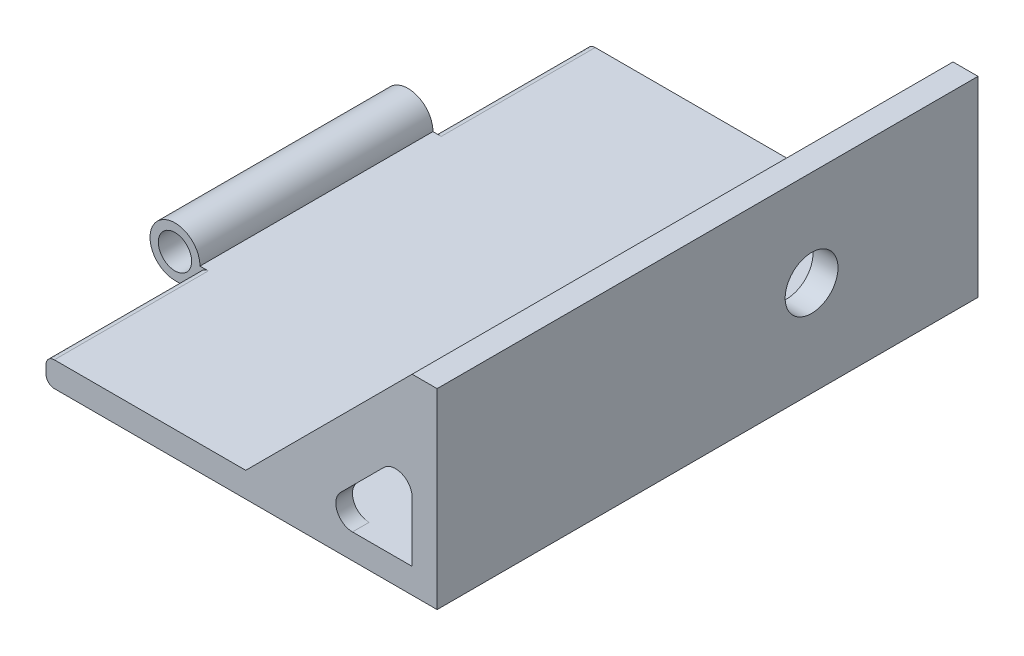
ISO-10303-21;
HEADER;
FILE_DESCRIPTION(('STEP AP214'),'2;1');
FILE_NAME('part.step','',(''),(''),'','','');
FILE_SCHEMA(('AUTOMOTIVE_DESIGN { 1 0 10303 214 1 1 1 1 }'));
ENDSEC;
DATA;
#1=APPLICATION_CONTEXT('core data for automotive mechanical design processes');
#2=APPLICATION_PROTOCOL_DEFINITION('international standard','automotive_design',2000,#1);
#3=PRODUCT_CONTEXT('',#1,'mechanical');
#4=PRODUCT('Part','Part','',(#3));
#5=PRODUCT_RELATED_PRODUCT_CATEGORY('part','',(#4));
#6=PRODUCT_DEFINITION_FORMATION('','',#4);
#7=PRODUCT_DEFINITION_CONTEXT('part definition',#1,'design');
#8=PRODUCT_DEFINITION('design','',#6,#7);
#9=PRODUCT_DEFINITION_SHAPE('','',#8);
#10=(LENGTH_UNIT() NAMED_UNIT(*) SI_UNIT(.MILLI.,.METRE.));
#11=(NAMED_UNIT(*) PLANE_ANGLE_UNIT() SI_UNIT($,.RADIAN.));
#12=(NAMED_UNIT(*) SI_UNIT($,.STERADIAN.) SOLID_ANGLE_UNIT());
#13=UNCERTAINTY_MEASURE_WITH_UNIT(LENGTH_MEASURE(1.E-05),#10,'distance_accuracy_value','');
#14=(GEOMETRIC_REPRESENTATION_CONTEXT(3) GLOBAL_UNCERTAINTY_ASSIGNED_CONTEXT((#13)) GLOBAL_UNIT_ASSIGNED_CONTEXT((#10,
#11,#12)) REPRESENTATION_CONTEXT('',''));
#15=CARTESIAN_POINT('',(0.,0.,0.));
#16=DIRECTION('',(0.,0.,1.));
#17=DIRECTION('',(1.,0.,0.));
#18=AXIS2_PLACEMENT_3D('',#15,#16,#17);
#19=CARTESIAN_POINT('',(22.,23.,-32.5));
#20=DIRECTION('',(1.,0.,0.));
#21=DIRECTION('',(0.,0.,-1.));
#22=AXIS2_PLACEMENT_3D('',#19,#20,#21);
#23=PLANE('',#22);
#24=CARTESIAN_POINT('',(22.,11.5,-12.5));
#25=DIRECTION('',(1.,0.,0.));
#26=DIRECTION('',(0.,0.,-1.));
#27=AXIS2_PLACEMENT_3D('',#24,#25,#26);
#28=CIRCLE('',#27,3.175);
#29=CARTESIAN_POINT('',(22.,11.5,-15.675));
#30=VERTEX_POINT('',#29);
#31=EDGE_CURVE('E412',#30,#30,#28,.T.);
#32=ORIENTED_EDGE('',*,*,#31,.T.);
#33=EDGE_LOOP('',(#32));
#34=FACE_BOUND('',#33,.T.);
#35=DIRECTION('',(0.,-1.,0.));
#36=VECTOR('',#35,1.);
#37=CARTESIAN_POINT('',(22.,3.,-30.5));
#38=LINE('',#37,#36);
#39=CARTESIAN_POINT('',(22.,23.,-30.5));
#40=VERTEX_POINT('',#39);
#41=CARTESIAN_POINT('',(22.,10.1715728752541,-30.5));
#42=VERTEX_POINT('',#41);
#43=EDGE_CURVE('E235',#40,#42,#38,.T.);
#44=ORIENTED_EDGE('',*,*,#43,.T.);
#45=DIRECTION('',(0.,0.,1.));
#46=VECTOR('',#45,1.);
#47=CARTESIAN_POINT('',(22.,10.1715728752541,-32.5));
#48=LINE('',#47,#46);
#49=CARTESIAN_POINT('',(22.,10.1715728752541,-32.5));
#50=VERTEX_POINT('',#49);
#51=EDGE_CURVE('E384',#42,#50,#48,.F.);
#52=ORIENTED_EDGE('',*,*,#51,.T.);
#53=DIRECTION('',(0.,1.,0.));
#54=VECTOR('',#53,1.);
#55=CARTESIAN_POINT('',(22.,3.,-32.5));
#56=LINE('',#55,#54);
#57=CARTESIAN_POINT('',(22.,3.,-32.5));
#58=VERTEX_POINT('',#57);
#59=EDGE_CURVE('E216',#58,#50,#56,.T.);
#60=ORIENTED_EDGE('',*,*,#59,.F.);
#61=DIRECTION('',(0.,0.,1.));
#62=VECTOR('',#61,1.);
#63=CARTESIAN_POINT('',(22.,3.,-32.5));
#64=LINE('',#63,#62);
#65=CARTESIAN_POINT('',(22.,3.,32.5));
#66=VERTEX_POINT('',#65);
#67=EDGE_CURVE('E204',#58,#66,#64,.T.);
#68=ORIENTED_EDGE('',*,*,#67,.T.);
#69=DIRECTION('',(0.,1.,0.));
#70=VECTOR('',#69,1.);
#71=CARTESIAN_POINT('',(22.,15.0000000000004,32.5));
#72=LINE('',#71,#70);
#73=CARTESIAN_POINT('',(22.,10.1715728752541,32.5));
#74=VERTEX_POINT('',#73);
#75=EDGE_CURVE('E209',#66,#74,#72,.T.);
#76=ORIENTED_EDGE('',*,*,#75,.T.);
#77=DIRECTION('',(0.,0.,1.));
#78=VECTOR('',#77,1.);
#79=CARTESIAN_POINT('',(22.,10.1715728752541,30.5));
#80=LINE('',#79,#78);
#81=CARTESIAN_POINT('',(22.,10.1715728752541,30.5));
#82=VERTEX_POINT('',#81);
#83=EDGE_CURVE('E382',#74,#82,#80,.F.);
#84=ORIENTED_EDGE('',*,*,#83,.T.);
#85=DIRECTION('',(0.,1.,0.));
#86=VECTOR('',#85,1.);
#87=CARTESIAN_POINT('',(22.,23.,30.5));
#88=LINE('',#87,#86);
#89=CARTESIAN_POINT('',(22.,23.,30.5));
#90=VERTEX_POINT('',#89);
#91=EDGE_CURVE('E252',#82,#90,#88,.T.);
#92=ORIENTED_EDGE('',*,*,#91,.T.);
#93=DIRECTION('',(0.,0.,1.));
#94=VECTOR('',#93,1.);
#95=CARTESIAN_POINT('',(22.,23.,-32.5));
#96=LINE('',#95,#94);
#97=EDGE_CURVE('E265',#40,#90,#96,.T.);
#98=ORIENTED_EDGE('',*,*,#97,.F.);
#99=EDGE_LOOP('',(#44,#52,#60,#68,#76,#84,#92,#98));
#100=FACE_BOUND('',#99,.T.);
#101=ADVANCED_FACE('F33',(#34,#100),#23,.F.);
#102=CARTESIAN_POINT('',(0.,3.,0.));
#103=DIRECTION('',(0.,1.,0.));
#104=DIRECTION('',(0.,0.,1.));
#105=AXIS2_PLACEMENT_3D('',#102,#103,#104);
#106=PLANE('',#105);
#107=DIRECTION('',(1.,0.,0.));
#108=VECTOR('',#107,1.);
#109=CARTESIAN_POINT('',(-25.,2.99999999999999,-32.5));
#110=LINE('',#109,#108);
#111=CARTESIAN_POINT('',(14.8284271247461,3.,-32.5));
#112=VERTEX_POINT('',#111);
#113=EDGE_CURVE('E222',#112,#58,#110,.T.);
#114=ORIENTED_EDGE('',*,*,#113,.F.);
#115=DIRECTION('',(0.,0.,1.));
#116=VECTOR('',#115,1.);
#117=CARTESIAN_POINT('',(14.8284271247461,3.,0.));
#118=LINE('',#117,#116);
#119=CARTESIAN_POINT('',(14.8284271247461,3.,-30.5));
#120=VERTEX_POINT('',#119);
#121=EDGE_CURVE('E374',#112,#120,#118,.T.);
#122=ORIENTED_EDGE('',*,*,#121,.T.);
#123=DIRECTION('',(-1.,0.,0.));
#124=VECTOR('',#123,1.);
#125=CARTESIAN_POINT('',(2.00000000000023,3.,-30.5));
#126=LINE('',#125,#124);
#127=CARTESIAN_POINT('',(2.00000000000023,3.,-30.5));
#128=VERTEX_POINT('',#127);
#129=EDGE_CURVE('E237',#120,#128,#126,.T.);
#130=ORIENTED_EDGE('',*,*,#129,.T.);
#131=DIRECTION('',(0.,0.,-1.));
#132=VECTOR('',#131,1.);
#133=CARTESIAN_POINT('',(2.00000000000023,3.,-30.5));
#134=LINE('',#133,#132);
#135=CARTESIAN_POINT('',(2.00000000000023,3.,-32.5));
#136=VERTEX_POINT('',#135);
#137=EDGE_CURVE('E241',#128,#136,#134,.T.);
#138=ORIENTED_EDGE('',*,*,#137,.T.);
#139=DIRECTION('',(-1.,0.,0.));
#140=VECTOR('',#139,1.);
#141=CARTESIAN_POINT('',(-25.,3.,-32.5));
#142=LINE('',#141,#140);
#143=CARTESIAN_POINT('',(-21.,3.,-32.5));
#144=VERTEX_POINT('',#143);
#145=EDGE_CURVE('E304',#136,#144,#142,.T.);
#146=ORIENTED_EDGE('',*,*,#145,.T.);
#147=DIRECTION('',(0.,0.,-1.));
#148=VECTOR('',#147,1.);
#149=CARTESIAN_POINT('',(-21.,3.,-14.));
#150=LINE('',#149,#148);
#151=CARTESIAN_POINT('',(-21.,3.,-14.));
#152=VERTEX_POINT('',#151);
#153=EDGE_CURVE('E358',#144,#152,#150,.F.);
#154=ORIENTED_EDGE('',*,*,#153,.T.);
#155=DIRECTION('',(-1.,0.,0.));
#156=VECTOR('',#155,1.);
#157=CARTESIAN_POINT('',(0.,3.,-14.));
#158=LINE('',#157,#156);
#159=CARTESIAN_POINT('',(-22.,3.,-14.));
#160=VERTEX_POINT('',#159);
#161=EDGE_CURVE('E356',#152,#160,#158,.T.);
#162=ORIENTED_EDGE('',*,*,#161,.T.);
#163=DIRECTION('',(0.,0.,1.));
#164=VECTOR('',#163,1.);
#165=CARTESIAN_POINT('',(-22.,3.,-14.));
#166=LINE('',#165,#164);
#167=CARTESIAN_POINT('',(-22.,3.,14.));
#168=VERTEX_POINT('',#167);
#169=EDGE_CURVE('E282',#168,#160,#166,.F.);
#170=ORIENTED_EDGE('',*,*,#169,.F.);
#171=DIRECTION('',(1.,0.,0.));
#172=VECTOR('',#171,1.);
#173=CARTESIAN_POINT('',(0.,3.,14.));
#174=LINE('',#173,#172);
#175=CARTESIAN_POINT('',(-21.,3.,14.));
#176=VERTEX_POINT('',#175);
#177=EDGE_CURVE('E350',#168,#176,#174,.T.);
#178=ORIENTED_EDGE('',*,*,#177,.T.);
#179=DIRECTION('',(0.,0.,1.));
#180=VECTOR('',#179,1.);
#181=CARTESIAN_POINT('',(-21.,3.,32.5));
#182=LINE('',#181,#180);
#183=CARTESIAN_POINT('',(-21.,3.,32.5));
#184=VERTEX_POINT('',#183);
#185=EDGE_CURVE('E353',#176,#184,#182,.T.);
#186=ORIENTED_EDGE('',*,*,#185,.T.);
#187=DIRECTION('',(1.,0.,0.));
#188=VECTOR('',#187,1.);
#189=CARTESIAN_POINT('',(-25.,3.,32.5));
#190=LINE('',#189,#188);
#191=CARTESIAN_POINT('',(2.00000000000023,3.,32.5));
#192=VERTEX_POINT('',#191);
#193=EDGE_CURVE('E306',#184,#192,#190,.T.);
#194=ORIENTED_EDGE('',*,*,#193,.T.);
#195=DIRECTION('',(0.,0.,1.));
#196=VECTOR('',#195,1.);
#197=CARTESIAN_POINT('',(2.00000000000023,3.,30.5));
#198=LINE('',#197,#196);
#199=CARTESIAN_POINT('',(2.00000000000023,3.,30.5));
#200=VERTEX_POINT('',#199);
#201=EDGE_CURVE('E254',#200,#192,#198,.T.);
#202=ORIENTED_EDGE('',*,*,#201,.F.);
#203=DIRECTION('',(1.,0.,0.));
#204=VECTOR('',#203,1.);
#205=CARTESIAN_POINT('',(22.,3.,30.5));
#206=LINE('',#205,#204);
#207=CARTESIAN_POINT('',(14.8284271247461,3.,30.5));
#208=VERTEX_POINT('',#207);
#209=EDGE_CURVE('E250',#200,#208,#206,.T.);
#210=ORIENTED_EDGE('',*,*,#209,.T.);
#211=DIRECTION('',(0.,0.,1.));
#212=VECTOR('',#211,1.);
#213=CARTESIAN_POINT('',(14.8284271247461,3.,0.));
#214=LINE('',#213,#212);
#215=CARTESIAN_POINT('',(14.8284271247461,3.,32.5));
#216=VERTEX_POINT('',#215);
#217=EDGE_CURVE('E207',#208,#216,#214,.T.);
#218=ORIENTED_EDGE('',*,*,#217,.T.);
#219=DIRECTION('',(1.,0.,0.));
#220=VECTOR('',#219,1.);
#221=CARTESIAN_POINT('',(22.,3.,32.5));
#222=LINE('',#221,#220);
#223=EDGE_CURVE('E200',#216,#66,#222,.T.);
#224=ORIENTED_EDGE('',*,*,#223,.T.);
#225=ORIENTED_EDGE('',*,*,#67,.F.);
#226=EDGE_LOOP('',(#114,#122,#130,#138,#146,#154,#162,#170,#178,#186,#194,#202,#210,#218,#224,#225));
#227=FACE_BOUND('',#226,.T.);
#228=ADVANCED_FACE('F203',(#227),#106,.T.);
#229=CARTESIAN_POINT('',(25.,3.,-32.5));
#230=DIRECTION('',(-1.,0.,0.));
#231=DIRECTION('',(0.,0.,1.));
#232=AXIS2_PLACEMENT_3D('',#229,#230,#231);
#233=PLANE('',#232);
#234=CARTESIAN_POINT('',(25.,11.5,-12.5));
#235=DIRECTION('',(1.,0.,0.));
#236=DIRECTION('',(0.,0.,-1.));
#237=AXIS2_PLACEMENT_3D('',#234,#235,#236);
#238=CIRCLE('',#237,3.175);
#239=CARTESIAN_POINT('',(25.,11.5,-15.675));
#240=VERTEX_POINT('',#239);
#241=EDGE_CURVE('E414',#240,#240,#238,.T.);
#242=ORIENTED_EDGE('',*,*,#241,.F.);
#243=EDGE_LOOP('',(#242));
#244=FACE_BOUND('',#243,.T.);
#245=DIRECTION('',(0.,0.,-1.));
#246=VECTOR('',#245,1.);
#247=CARTESIAN_POINT('',(25.,0.,-32.5));
#248=LINE('',#247,#246);
#249=CARTESIAN_POINT('',(25.,0.,32.5));
#250=VERTEX_POINT('',#249);
#251=CARTESIAN_POINT('',(25.,0.,-32.5));
#252=VERTEX_POINT('',#251);
#253=EDGE_CURVE('E301',#250,#252,#248,.T.);
#254=ORIENTED_EDGE('',*,*,#253,.T.);
#255=DIRECTION('',(0.,-1.,0.));
#256=VECTOR('',#255,1.);
#257=CARTESIAN_POINT('',(25.,3.,-32.5));
#258=LINE('',#257,#256);
#259=CARTESIAN_POINT('',(25.,23.,-32.5));
#260=VERTEX_POINT('',#259);
#261=EDGE_CURVE('E322',#260,#252,#258,.T.);
#262=ORIENTED_EDGE('',*,*,#261,.F.);
#263=DIRECTION('',(0.,0.,-1.));
#264=VECTOR('',#263,1.);
#265=CARTESIAN_POINT('',(25.,23.,-32.5));
#266=LINE('',#265,#264);
#267=CARTESIAN_POINT('',(25.,23.,32.5));
#268=VERTEX_POINT('',#267);
#269=EDGE_CURVE('E217',#268,#260,#266,.T.);
#270=ORIENTED_EDGE('',*,*,#269,.F.);
#271=DIRECTION('',(0.,-1.,0.));
#272=VECTOR('',#271,1.);
#273=CARTESIAN_POINT('',(25.,3.,32.5));
#274=LINE('',#273,#272);
#275=EDGE_CURVE('E310',#268,#250,#274,.T.);
#276=ORIENTED_EDGE('',*,*,#275,.T.);
#277=EDGE_LOOP('',(#254,#262,#270,#276));
#278=FACE_BOUND('',#277,.T.);
#279=ADVANCED_FACE('F423',(#244,#278),#233,.F.);
#280=CARTESIAN_POINT('',(-25.,3.,-32.5));
#281=DIRECTION('',(0.,0.,1.));
#282=DIRECTION('',(1.,0.,0.));
#283=AXIS2_PLACEMENT_3D('',#280,#281,#282);
#284=PLANE('',#283);
#285=ORIENTED_EDGE('',*,*,#59,.T.);
#286=CARTESIAN_POINT('',(20.,10.1715728752541,-32.5));
#287=DIRECTION('',(0.,0.,1.));
#288=DIRECTION('',(1.,0.,0.));
#289=AXIS2_PLACEMENT_3D('',#286,#287,#288);
#290=CIRCLE('',#289,2.);
#291=CARTESIAN_POINT('',(18.5857864376269,11.5857864376271,-32.5));
#292=VERTEX_POINT('',#291);
#293=EDGE_CURVE('E397',#50,#292,#290,.T.);
#294=ORIENTED_EDGE('',*,*,#293,.T.);
#295=DIRECTION('',(-0.707106781186536,-0.707106781186559,0.));
#296=VECTOR('',#295,1.);
#297=CARTESIAN_POINT('',(-7.49999999999943,-14.5,-32.5));
#298=LINE('',#297,#296);
#299=CARTESIAN_POINT('',(13.414213562373,6.41421356237308,-32.5));
#300=VERTEX_POINT('',#299);
#301=EDGE_CURVE('E231',#292,#300,#298,.T.);
#302=ORIENTED_EDGE('',*,*,#301,.T.);
#303=CARTESIAN_POINT('',(14.8284271247461,5.,-32.5));
#304=DIRECTION('',(0.,0.,1.));
#305=DIRECTION('',(1.,0.,0.));
#306=AXIS2_PLACEMENT_3D('',#303,#304,#305);
#307=CIRCLE('',#306,2.);
#308=EDGE_CURVE('E392',#300,#112,#307,.T.);
#309=ORIENTED_EDGE('',*,*,#308,.T.);
#310=ORIENTED_EDGE('',*,*,#113,.T.);
#311=EDGE_LOOP('',(#285,#294,#302,#309,#310));
#312=FACE_BOUND('',#311,.T.);
#313=ORIENTED_EDGE('',*,*,#145,.F.);
#314=DIRECTION('',(0.707106781186543,0.707106781186552,0.));
#315=VECTOR('',#314,1.);
#316=CARTESIAN_POINT('',(22.,23.,-32.5));
#317=LINE('',#316,#315);
#318=CARTESIAN_POINT('',(22.,23.,-32.5));
#319=VERTEX_POINT('',#318);
#320=EDGE_CURVE('E234',#136,#319,#317,.T.);
#321=ORIENTED_EDGE('',*,*,#320,.T.);
#322=DIRECTION('',(-1.,0.,0.));
#323=VECTOR('',#322,1.);
#324=CARTESIAN_POINT('',(25.,23.,-32.5));
#325=LINE('',#324,#323);
#326=EDGE_CURVE('E262',#260,#319,#325,.T.);
#327=ORIENTED_EDGE('',*,*,#326,.F.);
#328=ORIENTED_EDGE('',*,*,#261,.T.);
#329=DIRECTION('',(-1.,0.,0.));
#330=VECTOR('',#329,1.);
#331=CARTESIAN_POINT('',(-25.,0.,-32.5));
#332=LINE('',#331,#330);
#333=CARTESIAN_POINT('',(-21.,0.,-32.5));
#334=VERTEX_POINT('',#333);
#335=EDGE_CURVE('E313',#252,#334,#332,.T.);
#336=ORIENTED_EDGE('',*,*,#335,.T.);
#337=CARTESIAN_POINT('',(-21.,1.,-32.5));
#338=DIRECTION('',(0.,0.,1.));
#339=DIRECTION('',(1.,0.,0.));
#340=AXIS2_PLACEMENT_3D('',#337,#338,#339);
#341=CIRCLE('',#340,1.);
#342=CARTESIAN_POINT('',(-22.,0.999999999999999,-32.5));
#343=VERTEX_POINT('',#342);
#344=EDGE_CURVE('E343',#334,#343,#341,.F.);
#345=ORIENTED_EDGE('',*,*,#344,.T.);
#346=DIRECTION('',(0.,-1.,0.));
#347=VECTOR('',#346,1.);
#348=CARTESIAN_POINT('',(-22.,3.,-32.5));
#349=LINE('',#348,#347);
#350=CARTESIAN_POINT('',(-22.,2.,-32.5));
#351=VERTEX_POINT('',#350);
#352=EDGE_CURVE('E287',#351,#343,#349,.T.);
#353=ORIENTED_EDGE('',*,*,#352,.F.);
#354=CARTESIAN_POINT('',(-21.,2.,-32.5));
#355=DIRECTION('',(0.,0.,1.));
#356=DIRECTION('',(1.,0.,0.));
#357=AXIS2_PLACEMENT_3D('',#354,#355,#356);
#358=CIRCLE('',#357,1.);
#359=EDGE_CURVE('E340',#351,#144,#358,.F.);
#360=ORIENTED_EDGE('',*,*,#359,.T.);
#361=EDGE_LOOP('',(#313,#321,#327,#328,#336,#345,#353,#360));
#362=FACE_BOUND('',#361,.T.);
#363=ADVANCED_FACE('F426',(#312,#362),#284,.F.);
#364=CARTESIAN_POINT('',(-25.,3.,32.5));
#365=DIRECTION('',(0.,0.,-1.));
#366=DIRECTION('',(-1.,0.,0.));
#367=AXIS2_PLACEMENT_3D('',#364,#365,#366);
#368=PLANE('',#367);
#369=ORIENTED_EDGE('',*,*,#223,.F.);
#370=CARTESIAN_POINT('',(14.8284271247461,5.,32.5));
#371=DIRECTION('',(0.,0.,-1.));
#372=DIRECTION('',(-1.,0.,0.));
#373=AXIS2_PLACEMENT_3D('',#370,#371,#372);
#374=CIRCLE('',#373,2.);
#375=CARTESIAN_POINT('',(13.414213562373,6.41421356237307,32.5));
#376=VERTEX_POINT('',#375);
#377=EDGE_CURVE('E48',#216,#376,#374,.T.);
#378=ORIENTED_EDGE('',*,*,#377,.T.);
#379=DIRECTION('',(-0.707106781186536,-0.707106781186559,0.));
#380=VECTOR('',#379,1.);
#381=CARTESIAN_POINT('',(10.,3.,32.5));
#382=LINE('',#381,#380);
#383=CARTESIAN_POINT('',(18.5857864376269,11.5857864376272,32.5));
#384=VERTEX_POINT('',#383);
#385=EDGE_CURVE('E210',#384,#376,#382,.T.);
#386=ORIENTED_EDGE('',*,*,#385,.F.);
#387=CARTESIAN_POINT('',(20.,10.1715728752541,32.5));
#388=DIRECTION('',(0.,0.,-1.));
#389=DIRECTION('',(-1.,0.,0.));
#390=AXIS2_PLACEMENT_3D('',#387,#388,#389);
#391=CIRCLE('',#390,2.);
#392=EDGE_CURVE('E41',#384,#74,#391,.T.);
#393=ORIENTED_EDGE('',*,*,#392,.T.);
#394=ORIENTED_EDGE('',*,*,#75,.F.);
#395=EDGE_LOOP('',(#369,#378,#386,#393,#394));
#396=FACE_BOUND('',#395,.T.);
#397=DIRECTION('',(0.,1.,0.));
#398=VECTOR('',#397,1.);
#399=CARTESIAN_POINT('',(-22.,3.,32.5));
#400=LINE('',#399,#398);
#401=CARTESIAN_POINT('',(-22.,1.,32.5));
#402=VERTEX_POINT('',#401);
#403=CARTESIAN_POINT('',(-22.,2.,32.5));
#404=VERTEX_POINT('',#403);
#405=EDGE_CURVE('E293',#402,#404,#400,.T.);
#406=ORIENTED_EDGE('',*,*,#405,.F.);
#407=CARTESIAN_POINT('',(-21.,1.,32.5));
#408=DIRECTION('',(0.,0.,-1.));
#409=DIRECTION('',(-1.,0.,0.));
#410=AXIS2_PLACEMENT_3D('',#407,#408,#409);
#411=CIRCLE('',#410,1.);
#412=CARTESIAN_POINT('',(-21.,0.,32.5));
#413=VERTEX_POINT('',#412);
#414=EDGE_CURVE('E332',#402,#413,#411,.F.);
#415=ORIENTED_EDGE('',*,*,#414,.T.);
#416=DIRECTION('',(1.,0.,0.));
#417=VECTOR('',#416,1.);
#418=CARTESIAN_POINT('',(-25.,0.,32.5));
#419=LINE('',#418,#417);
#420=EDGE_CURVE('E307',#413,#250,#419,.T.);
#421=ORIENTED_EDGE('',*,*,#420,.T.);
#422=ORIENTED_EDGE('',*,*,#275,.F.);
#423=DIRECTION('',(1.,0.,0.));
#424=VECTOR('',#423,1.);
#425=CARTESIAN_POINT('',(25.,23.,32.5));
#426=LINE('',#425,#424);
#427=CARTESIAN_POINT('',(22.,23.,32.5));
#428=VERTEX_POINT('',#427);
#429=EDGE_CURVE('E269',#428,#268,#426,.T.);
#430=ORIENTED_EDGE('',*,*,#429,.F.);
#431=DIRECTION('',(-0.707106781186544,-0.707106781186552,0.));
#432=VECTOR('',#431,1.);
#433=CARTESIAN_POINT('',(2.00000000000023,3.,32.5));
#434=LINE('',#433,#432);
#435=EDGE_CURVE('E246',#428,#192,#434,.T.);
#436=ORIENTED_EDGE('',*,*,#435,.T.);
#437=ORIENTED_EDGE('',*,*,#193,.F.);
#438=CARTESIAN_POINT('',(-21.,2.,32.5));
#439=DIRECTION('',(0.,0.,-1.));
#440=DIRECTION('',(-1.,0.,0.));
#441=AXIS2_PLACEMENT_3D('',#438,#439,#440);
#442=CIRCLE('',#441,1.);
#443=EDGE_CURVE('E330',#184,#404,#442,.F.);
#444=ORIENTED_EDGE('',*,*,#443,.T.);
#445=EDGE_LOOP('',(#406,#415,#421,#422,#430,#436,#437,#444));
#446=FACE_BOUND('',#445,.T.);
#447=ADVANCED_FACE('F220',(#396,#446),#368,.F.);
#448=CARTESIAN_POINT('',(0.,0.,0.));
#449=DIRECTION('',(0.,1.,0.));
#450=DIRECTION('',(0.,0.,1.));
#451=AXIS2_PLACEMENT_3D('',#448,#449,#450);
#452=PLANE('',#451);
#453=ORIENTED_EDGE('',*,*,#420,.F.);
#454=DIRECTION('',(0.,0.,1.));
#455=VECTOR('',#454,1.);
#456=CARTESIAN_POINT('',(-21.,0.,0.));
#457=LINE('',#456,#455);
#458=CARTESIAN_POINT('',(-21.,0.,14.));
#459=VERTEX_POINT('',#458);
#460=EDGE_CURVE('E337',#413,#459,#457,.F.);
#461=ORIENTED_EDGE('',*,*,#460,.T.);
#462=DIRECTION('',(1.,0.,0.));
#463=VECTOR('',#462,1.);
#464=CARTESIAN_POINT('',(-25.,0.,14.));
#465=LINE('',#464,#463);
#466=CARTESIAN_POINT('',(-25.,0.,14.));
#467=VERTEX_POINT('',#466);
#468=EDGE_CURVE('E296',#467,#459,#465,.T.);
#469=ORIENTED_EDGE('',*,*,#468,.F.);
#470=DIRECTION('',(0.,0.,1.));
#471=VECTOR('',#470,1.);
#472=CARTESIAN_POINT('',(-25.,0.,-32.5));
#473=LINE('',#472,#471);
#474=CARTESIAN_POINT('',(-25.,0.,-14.));
#475=VERTEX_POINT('',#474);
#476=EDGE_CURVE('E316',#475,#467,#473,.T.);
#477=ORIENTED_EDGE('',*,*,#476,.F.);
#478=DIRECTION('',(-1.,0.,0.));
#479=VECTOR('',#478,1.);
#480=CARTESIAN_POINT('',(-25.,0.,-14.));
#481=LINE('',#480,#479);
#482=CARTESIAN_POINT('',(-21.,0.,-14.));
#483=VERTEX_POINT('',#482);
#484=EDGE_CURVE('E291',#483,#475,#481,.T.);
#485=ORIENTED_EDGE('',*,*,#484,.F.);
#486=DIRECTION('',(0.,0.,-1.));
#487=VECTOR('',#486,1.);
#488=CARTESIAN_POINT('',(-21.,0.,0.));
#489=LINE('',#488,#487);
#490=EDGE_CURVE('E334',#483,#334,#489,.T.);
#491=ORIENTED_EDGE('',*,*,#490,.T.);
#492=ORIENTED_EDGE('',*,*,#335,.F.);
#493=ORIENTED_EDGE('',*,*,#253,.F.);
#494=EDGE_LOOP('',(#453,#461,#469,#477,#485,#491,#492,#493));
#495=FACE_BOUND('',#494,.T.);
#496=ADVANCED_FACE('F433',(#495),#452,.F.);
#497=CARTESIAN_POINT('',(-22.,3.,14.));
#498=DIRECTION('',(1.,0.,0.));
#499=DIRECTION('',(0.,0.,-1.));
#500=AXIS2_PLACEMENT_3D('',#497,#498,#499);
#501=PLANE('',#500);
#502=DIRECTION('',(0.,1.,0.));
#503=VECTOR('',#502,1.);
#504=CARTESIAN_POINT('',(-22.,3.,14.));
#505=LINE('',#504,#503);
#506=CARTESIAN_POINT('',(-22.,1.,14.));
#507=VERTEX_POINT('',#506);
#508=CARTESIAN_POINT('',(-22.,2.,14.));
#509=VERTEX_POINT('',#508);
#510=EDGE_CURVE('E298',#507,#509,#505,.T.);
#511=ORIENTED_EDGE('',*,*,#510,.F.);
#512=DIRECTION('',(0.,0.,1.));
#513=VECTOR('',#512,1.);
#514=CARTESIAN_POINT('',(-22.,1.,14.));
#515=LINE('',#514,#513);
#516=EDGE_CURVE('E327',#507,#402,#515,.T.);
#517=ORIENTED_EDGE('',*,*,#516,.T.);
#518=ORIENTED_EDGE('',*,*,#405,.T.);
#519=DIRECTION('',(0.,0.,1.));
#520=VECTOR('',#519,1.);
#521=CARTESIAN_POINT('',(-22.,2.,14.));
#522=LINE('',#521,#520);
#523=EDGE_CURVE('E325',#404,#509,#522,.F.);
#524=ORIENTED_EDGE('',*,*,#523,.T.);
#525=EDGE_LOOP('',(#511,#517,#518,#524));
#526=FACE_BOUND('',#525,.T.);
#527=ADVANCED_FACE('F451',(#526),#501,.F.);
#528=CARTESIAN_POINT('',(0.,0.,14.));
#529=DIRECTION('',(0.,0.,1.));
#530=DIRECTION('',(1.,0.,0.));
#531=AXIS2_PLACEMENT_3D('',#528,#529,#530);
#532=PLANE('',#531);
#533=CARTESIAN_POINT('',(-25.,3.,14.));
#534=DIRECTION('',(0.,0.,1.));
#535=DIRECTION('',(1.,0.,0.));
#536=AXIS2_PLACEMENT_3D('',#533,#534,#535);
#537=CIRCLE('',#536,2.);
#538=CARTESIAN_POINT('',(-23.,3.,14.));
#539=VERTEX_POINT('',#538);
#540=EDGE_CURVE('E271',#539,#539,#537,.T.);
#541=ORIENTED_EDGE('',*,*,#540,.F.);
#542=EDGE_LOOP('',(#541));
#543=FACE_BOUND('',#542,.T.);
#544=CARTESIAN_POINT('',(-25.,3.,14.));
#545=DIRECTION('',(0.,0.,1.));
#546=DIRECTION('',(1.,0.,0.));
#547=AXIS2_PLACEMENT_3D('',#544,#545,#546);
#548=CIRCLE('',#547,3.);
#549=EDGE_CURVE('E276',#168,#467,#548,.T.);
#550=ORIENTED_EDGE('',*,*,#549,.T.);
#551=ORIENTED_EDGE('',*,*,#468,.T.);
#552=CARTESIAN_POINT('',(-21.,1.,14.));
#553=DIRECTION('',(0.,0.,1.));
#554=DIRECTION('',(1.,0.,0.));
#555=AXIS2_PLACEMENT_3D('',#552,#553,#554);
#556=CIRCLE('',#555,1.);
#557=EDGE_CURVE('E361',#459,#507,#556,.F.);
#558=ORIENTED_EDGE('',*,*,#557,.T.);
#559=ORIENTED_EDGE('',*,*,#510,.T.);
#560=CARTESIAN_POINT('',(-21.,2.,14.));
#561=DIRECTION('',(0.,0.,1.));
#562=DIRECTION('',(1.,0.,0.));
#563=AXIS2_PLACEMENT_3D('',#560,#561,#562);
#564=CIRCLE('',#563,1.);
#565=EDGE_CURVE('E368',#509,#176,#564,.F.);
#566=ORIENTED_EDGE('',*,*,#565,.T.);
#567=ORIENTED_EDGE('',*,*,#177,.F.);
#568=EDGE_LOOP('',(#550,#551,#558,#559,#566,#567));
#569=FACE_BOUND('',#568,.T.);
#570=ADVANCED_FACE('F455',(#543,#569),#532,.T.);
#571=CARTESIAN_POINT('',(-22.,3.,-14.));
#572=DIRECTION('',(1.,0.,0.));
#573=DIRECTION('',(0.,1.,0.));
#574=AXIS2_PLACEMENT_3D('',#571,#572,#573);
#575=PLANE('',#574);
#576=ORIENTED_EDGE('',*,*,#352,.T.);
#577=DIRECTION('',(0.,0.,-1.));
#578=VECTOR('',#577,1.);
#579=CARTESIAN_POINT('',(-22.,0.999999999999999,-14.));
#580=LINE('',#579,#578);
#581=CARTESIAN_POINT('',(-22.,0.999999999999999,-14.));
#582=VERTEX_POINT('',#581);
#583=EDGE_CURVE('E348',#343,#582,#580,.F.);
#584=ORIENTED_EDGE('',*,*,#583,.T.);
#585=DIRECTION('',(0.,-1.,0.));
#586=VECTOR('',#585,1.);
#587=CARTESIAN_POINT('',(-22.,3.,-14.));
#588=LINE('',#587,#586);
#589=CARTESIAN_POINT('',(-22.,2.,-14.));
#590=VERTEX_POINT('',#589);
#591=EDGE_CURVE('E288',#590,#582,#588,.T.);
#592=ORIENTED_EDGE('',*,*,#591,.F.);
#593=DIRECTION('',(0.,0.,-1.));
#594=VECTOR('',#593,1.);
#595=CARTESIAN_POINT('',(-22.,2.,-32.5));
#596=LINE('',#595,#594);
#597=EDGE_CURVE('E345',#590,#351,#596,.T.);
#598=ORIENTED_EDGE('',*,*,#597,.T.);
#599=EDGE_LOOP('',(#576,#584,#592,#598));
#600=FACE_BOUND('',#599,.T.);
#601=ADVANCED_FACE('F475',(#600),#575,.F.);
#602=CARTESIAN_POINT('',(0.,0.,-14.));
#603=DIRECTION('',(0.,0.,1.));
#604=DIRECTION('',(1.,0.,0.));
#605=AXIS2_PLACEMENT_3D('',#602,#603,#604);
#606=PLANE('',#605);
#607=CARTESIAN_POINT('',(-25.,3.,-14.));
#608=DIRECTION('',(0.,0.,1.));
#609=DIRECTION('',(1.,0.,0.));
#610=AXIS2_PLACEMENT_3D('',#607,#608,#609);
#611=CIRCLE('',#610,2.);
#612=CARTESIAN_POINT('',(-23.,3.,-14.));
#613=VERTEX_POINT('',#612);
#614=EDGE_CURVE('E273',#613,#613,#611,.T.);
#615=ORIENTED_EDGE('',*,*,#614,.T.);
#616=EDGE_LOOP('',(#615));
#617=FACE_BOUND('',#616,.T.);
#618=ORIENTED_EDGE('',*,*,#484,.T.);
#619=CARTESIAN_POINT('',(-25.,3.,-14.));
#620=DIRECTION('',(0.,0.,1.));
#621=DIRECTION('',(1.,0.,0.));
#622=AXIS2_PLACEMENT_3D('',#619,#620,#621);
#623=CIRCLE('',#622,3.);
#624=EDGE_CURVE('E279',#160,#475,#623,.T.);
#625=ORIENTED_EDGE('',*,*,#624,.F.);
#626=ORIENTED_EDGE('',*,*,#161,.F.);
#627=CARTESIAN_POINT('',(-21.,2.,-14.));
#628=DIRECTION('',(0.,0.,1.));
#629=DIRECTION('',(1.,0.,0.));
#630=AXIS2_PLACEMENT_3D('',#627,#628,#629);
#631=CIRCLE('',#630,1.);
#632=EDGE_CURVE('E366',#152,#590,#631,.T.);
#633=ORIENTED_EDGE('',*,*,#632,.T.);
#634=ORIENTED_EDGE('',*,*,#591,.T.);
#635=CARTESIAN_POINT('',(-21.,1.,-14.));
#636=DIRECTION('',(0.,0.,1.));
#637=DIRECTION('',(1.,0.,0.));
#638=AXIS2_PLACEMENT_3D('',#635,#636,#637);
#639=CIRCLE('',#638,1.);
#640=EDGE_CURVE('E363',#582,#483,#639,.T.);
#641=ORIENTED_EDGE('',*,*,#640,.T.);
#642=EDGE_LOOP('',(#618,#625,#626,#633,#634,#641));
#643=FACE_BOUND('',#642,.T.);
#644=ADVANCED_FACE('F468',(#617,#643),#606,.F.);
#645=CARTESIAN_POINT('',(-25.,3.,-14.));
#646=DIRECTION('',(0.,0.,1.));
#647=DIRECTION('',(1.,0.,0.));
#648=AXIS2_PLACEMENT_3D('',#645,#646,#647);
#649=CYLINDRICAL_SURFACE('',#648,3.);
#650=ORIENTED_EDGE('',*,*,#549,.F.);
#651=ORIENTED_EDGE('',*,*,#169,.T.);
#652=ORIENTED_EDGE('',*,*,#624,.T.);
#653=ORIENTED_EDGE('',*,*,#476,.T.);
#654=EDGE_LOOP('',(#650,#651,#652,#653));
#655=FACE_BOUND('',#654,.T.);
#656=ADVANCED_FACE('F463',(#655),#649,.T.);
#657=CARTESIAN_POINT('',(-25.,3.,-14.));
#658=DIRECTION('',(0.,0.,1.));
#659=DIRECTION('',(1.,0.,0.));
#660=AXIS2_PLACEMENT_3D('',#657,#658,#659);
#661=CYLINDRICAL_SURFACE('',#660,2.);
#662=ORIENTED_EDGE('',*,*,#614,.F.);
#663=EDGE_LOOP('',(#662));
#664=FACE_BOUND('',#663,.T.);
#665=ORIENTED_EDGE('',*,*,#540,.T.);
#666=EDGE_LOOP('',(#665));
#667=FACE_BOUND('',#666,.T.);
#668=ADVANCED_FACE('F511',(#664,#667),#661,.F.);
#669=CARTESIAN_POINT('',(-21.,1.,14.));
#670=DIRECTION('',(0.,0.,1.));
#671=DIRECTION('',(1.,0.,0.));
#672=AXIS2_PLACEMENT_3D('',#669,#670,#671);
#673=CYLINDRICAL_SURFACE('',#672,1.);
#674=ORIENTED_EDGE('',*,*,#557,.F.);
#675=ORIENTED_EDGE('',*,*,#460,.F.);
#676=ORIENTED_EDGE('',*,*,#414,.F.);
#677=ORIENTED_EDGE('',*,*,#516,.F.);
#678=EDGE_LOOP('',(#674,#675,#676,#677));
#679=FACE_BOUND('',#678,.T.);
#680=ADVANCED_FACE('F448',(#679),#673,.T.);
#681=CARTESIAN_POINT('',(-21.,1.,0.));
#682=DIRECTION('',(0.,0.,-1.));
#683=DIRECTION('',(-1.,0.,0.));
#684=AXIS2_PLACEMENT_3D('',#681,#682,#683);
#685=CYLINDRICAL_SURFACE('',#684,1.);
#686=ORIENTED_EDGE('',*,*,#640,.F.);
#687=ORIENTED_EDGE('',*,*,#583,.F.);
#688=ORIENTED_EDGE('',*,*,#344,.F.);
#689=ORIENTED_EDGE('',*,*,#490,.F.);
#690=EDGE_LOOP('',(#686,#687,#688,#689));
#691=FACE_BOUND('',#690,.T.);
#692=ADVANCED_FACE('F472',(#691),#685,.T.);
#693=CARTESIAN_POINT('',(-21.,2.,-14.));
#694=DIRECTION('',(0.,0.,1.));
#695=DIRECTION('',(1.,0.,0.));
#696=AXIS2_PLACEMENT_3D('',#693,#694,#695);
#697=CYLINDRICAL_SURFACE('',#696,1.);
#698=ORIENTED_EDGE('',*,*,#632,.F.);
#699=ORIENTED_EDGE('',*,*,#153,.F.);
#700=ORIENTED_EDGE('',*,*,#359,.F.);
#701=ORIENTED_EDGE('',*,*,#597,.F.);
#702=EDGE_LOOP('',(#698,#699,#700,#701));
#703=FACE_BOUND('',#702,.T.);
#704=ADVANCED_FACE('F479',(#703),#697,.T.);
#705=CARTESIAN_POINT('',(-21.,2.,0.));
#706=DIRECTION('',(0.,0.,-1.));
#707=DIRECTION('',(-1.,0.,0.));
#708=AXIS2_PLACEMENT_3D('',#705,#706,#707);
#709=CYLINDRICAL_SURFACE('',#708,1.);
#710=ORIENTED_EDGE('',*,*,#565,.F.);
#711=ORIENTED_EDGE('',*,*,#523,.F.);
#712=ORIENTED_EDGE('',*,*,#443,.F.);
#713=ORIENTED_EDGE('',*,*,#185,.F.);
#714=EDGE_LOOP('',(#710,#711,#712,#713));
#715=FACE_BOUND('',#714,.T.);
#716=ADVANCED_FACE('F458',(#715),#709,.T.);
#717=CARTESIAN_POINT('',(0.,23.,0.));
#718=DIRECTION('',(0.,-1.,0.));
#719=DIRECTION('',(0.,0.,-1.));
#720=AXIS2_PLACEMENT_3D('',#717,#718,#719);
#721=PLANE('',#720);
#722=ORIENTED_EDGE('',*,*,#269,.T.);
#723=ORIENTED_EDGE('',*,*,#326,.T.);
#724=EDGE_CURVE('E266',#319,#40,#96,.T.);
#725=ORIENTED_EDGE('',*,*,#724,.T.);
#726=ORIENTED_EDGE('',*,*,#97,.T.);
#727=DIRECTION('',(0.,0.,1.));
#728=VECTOR('',#727,1.);
#729=CARTESIAN_POINT('',(22.,23.,30.5));
#730=LINE('',#729,#728);
#731=EDGE_CURVE('E218',#90,#428,#730,.T.);
#732=ORIENTED_EDGE('',*,*,#731,.T.);
#733=ORIENTED_EDGE('',*,*,#429,.T.);
#734=EDGE_LOOP('',(#722,#723,#725,#726,#732,#733));
#735=FACE_BOUND('',#734,.T.);
#736=ADVANCED_FACE('F439',(#735),#721,.F.);
#737=CARTESIAN_POINT('',(2.00000000000023,3.,30.5));
#738=DIRECTION('',(-0.707106781186551,0.707106781186544,0.));
#739=DIRECTION('',(-0.707106781186544,-0.707106781186551,0.));
#740=AXIS2_PLACEMENT_3D('',#737,#738,#739);
#741=PLANE('',#740);
#742=ORIENTED_EDGE('',*,*,#435,.F.);
#743=ORIENTED_EDGE('',*,*,#731,.F.);
#744=DIRECTION('',(-0.707106781186544,-0.707106781186552,0.));
#745=VECTOR('',#744,1.);
#746=CARTESIAN_POINT('',(2.00000000000023,3.,30.5));
#747=LINE('',#746,#745);
#748=EDGE_CURVE('E247',#90,#200,#747,.T.);
#749=ORIENTED_EDGE('',*,*,#748,.T.);
#750=ORIENTED_EDGE('',*,*,#201,.T.);
#751=EDGE_LOOP('',(#742,#743,#749,#750));
#752=FACE_BOUND('',#751,.T.);
#753=ADVANCED_FACE('F492',(#752),#741,.T.);
#754=CARTESIAN_POINT('',(0.,0.,30.5));
#755=DIRECTION('',(0.,0.,-1.));
#756=DIRECTION('',(-1.,0.,0.));
#757=AXIS2_PLACEMENT_3D('',#754,#755,#756);
#758=PLANE('',#757);
#759=DIRECTION('',(0.707106781186536,0.707106781186559,0.));
#760=VECTOR('',#759,1.);
#761=CARTESIAN_POINT('',(3.50000000000017,-3.50000000000006,30.5));
#762=LINE('',#761,#760);
#763=CARTESIAN_POINT('',(13.414213562373,6.41421356237307,30.5));
#764=VERTEX_POINT('',#763);
#765=CARTESIAN_POINT('',(18.5857864376269,11.5857864376272,30.5));
#766=VERTEX_POINT('',#765);
#767=EDGE_CURVE('E228',#764,#766,#762,.T.);
#768=ORIENTED_EDGE('',*,*,#767,.F.);
#769=CARTESIAN_POINT('',(14.8284271247461,5.,30.5));
#770=DIRECTION('',(0.,0.,-1.));
#771=DIRECTION('',(-1.,0.,0.));
#772=AXIS2_PLACEMENT_3D('',#769,#770,#771);
#773=CIRCLE('',#772,2.);
#774=EDGE_CURVE('E400',#764,#208,#773,.F.);
#775=ORIENTED_EDGE('',*,*,#774,.T.);
#776=ORIENTED_EDGE('',*,*,#209,.F.);
#777=ORIENTED_EDGE('',*,*,#748,.F.);
#778=ORIENTED_EDGE('',*,*,#91,.F.);
#779=CARTESIAN_POINT('',(20.,10.1715728752541,30.5));
#780=DIRECTION('',(0.,0.,-1.));
#781=DIRECTION('',(-1.,0.,0.));
#782=AXIS2_PLACEMENT_3D('',#779,#780,#781);
#783=CIRCLE('',#782,2.);
#784=EDGE_CURVE('E11',#82,#766,#783,.F.);
#785=ORIENTED_EDGE('',*,*,#784,.T.);
#786=EDGE_LOOP('',(#768,#775,#776,#777,#778,#785));
#787=FACE_BOUND('',#786,.T.);
#788=ADVANCED_FACE('F405',(#787),#758,.T.);
#789=CARTESIAN_POINT('',(22.,23.,-30.5));
#790=DIRECTION('',(-0.707106781186552,0.707106781186543,0.));
#791=DIRECTION('',(-0.707106781186543,-0.707106781186552,0.));
#792=AXIS2_PLACEMENT_3D('',#789,#790,#791);
#793=PLANE('',#792);
#794=ORIENTED_EDGE('',*,*,#320,.F.);
#795=ORIENTED_EDGE('',*,*,#137,.F.);
#796=DIRECTION('',(0.707106781186543,0.707106781186552,0.));
#797=VECTOR('',#796,1.);
#798=CARTESIAN_POINT('',(22.,23.,-30.5));
#799=LINE('',#798,#797);
#800=EDGE_CURVE('E239',#128,#40,#799,.T.);
#801=ORIENTED_EDGE('',*,*,#800,.T.);
#802=ORIENTED_EDGE('',*,*,#724,.F.);
#803=EDGE_LOOP('',(#794,#795,#801,#802));
#804=FACE_BOUND('',#803,.T.);
#805=ADVANCED_FACE('F484',(#804),#793,.T.);
#806=CARTESIAN_POINT('',(0.,0.,-30.5));
#807=DIRECTION('',(0.,0.,-1.));
#808=DIRECTION('',(-1.,0.,0.));
#809=AXIS2_PLACEMENT_3D('',#806,#807,#808);
#810=PLANE('',#809);
#811=ORIENTED_EDGE('',*,*,#129,.F.);
#812=CARTESIAN_POINT('',(14.8284271247461,5.,-30.5));
#813=DIRECTION('',(0.,0.,-1.));
#814=DIRECTION('',(-1.,0.,0.));
#815=AXIS2_PLACEMENT_3D('',#812,#813,#814);
#816=CIRCLE('',#815,2.);
#817=CARTESIAN_POINT('',(13.414213562373,6.41421356237307,-30.5));
#818=VERTEX_POINT('',#817);
#819=EDGE_CURVE('E390',#120,#818,#816,.T.);
#820=ORIENTED_EDGE('',*,*,#819,.T.);
#821=DIRECTION('',(0.707106781186536,0.707106781186559,0.));
#822=VECTOR('',#821,1.);
#823=CARTESIAN_POINT('',(3.50000000000017,-3.50000000000006,-30.5));
#824=LINE('',#823,#822);
#825=CARTESIAN_POINT('',(18.5857864376269,11.5857864376271,-30.5));
#826=VERTEX_POINT('',#825);
#827=EDGE_CURVE('E370',#818,#826,#824,.T.);
#828=ORIENTED_EDGE('',*,*,#827,.T.);
#829=CARTESIAN_POINT('',(20.,10.1715728752541,-30.5));
#830=DIRECTION('',(0.,0.,-1.));
#831=DIRECTION('',(-1.,0.,0.));
#832=AXIS2_PLACEMENT_3D('',#829,#830,#831);
#833=CIRCLE('',#832,2.);
#834=EDGE_CURVE('E394',#826,#42,#833,.T.);
#835=ORIENTED_EDGE('',*,*,#834,.T.);
#836=ORIENTED_EDGE('',*,*,#43,.F.);
#837=ORIENTED_EDGE('',*,*,#800,.F.);
#838=EDGE_LOOP('',(#811,#820,#828,#835,#836,#837));
#839=FACE_BOUND('',#838,.T.);
#840=ADVANCED_FACE('F487',(#839),#810,.F.);
#841=CARTESIAN_POINT('',(10.,3.,-49.5));
#842=DIRECTION('',(-0.707106781186559,0.707106781186536,0.));
#843=DIRECTION('',(-0.707106781186536,-0.707106781186559,0.));
#844=AXIS2_PLACEMENT_3D('',#841,#842,#843);
#845=PLANE('',#844);
#846=ORIENTED_EDGE('',*,*,#827,.F.);
#847=DIRECTION('',(0.,0.,1.));
#848=VECTOR('',#847,1.);
#849=CARTESIAN_POINT('',(13.414213562373,6.41421356237307,-49.5));
#850=LINE('',#849,#848);
#851=EDGE_CURVE('E380',#818,#300,#850,.F.);
#852=ORIENTED_EDGE('',*,*,#851,.T.);
#853=ORIENTED_EDGE('',*,*,#301,.F.);
#854=DIRECTION('',(0.,0.,1.));
#855=VECTOR('',#854,1.);
#856=CARTESIAN_POINT('',(18.5857864376269,11.5857864376271,-30.5));
#857=LINE('',#856,#855);
#858=EDGE_CURVE('E377',#292,#826,#857,.T.);
#859=ORIENTED_EDGE('',*,*,#858,.T.);
#860=EDGE_LOOP('',(#846,#852,#853,#859));
#861=FACE_BOUND('',#860,.T.);
#862=ADVANCED_FACE('F556',(#861),#845,.F.);
#863=ORIENTED_EDGE('',*,*,#385,.T.);
#864=DIRECTION('',(0.,0.,1.));
#865=VECTOR('',#864,1.);
#866=CARTESIAN_POINT('',(13.414213562373,6.41421356237307,-49.5));
#867=LINE('',#866,#865);
#868=EDGE_CURVE('E388',#376,#764,#867,.F.);
#869=ORIENTED_EDGE('',*,*,#868,.T.);
#870=ORIENTED_EDGE('',*,*,#767,.T.);
#871=DIRECTION('',(0.,0.,1.));
#872=VECTOR('',#871,1.);
#873=CARTESIAN_POINT('',(18.5857864376269,11.5857864376272,32.5));
#874=LINE('',#873,#872);
#875=EDGE_CURVE('E386',#766,#384,#874,.T.);
#876=ORIENTED_EDGE('',*,*,#875,.T.);
#877=EDGE_LOOP('',(#863,#869,#870,#876));
#878=FACE_BOUND('',#877,.T.);
#879=ADVANCED_FACE('F411',(#878),#845,.F.);
#880=CARTESIAN_POINT('',(14.8284271247461,5.,0.));
#881=DIRECTION('',(0.,0.,1.));
#882=DIRECTION('',(1.,0.,0.));
#883=AXIS2_PLACEMENT_3D('',#880,#881,#882);
#884=CYLINDRICAL_SURFACE('',#883,2.);
#885=ORIENTED_EDGE('',*,*,#308,.F.);
#886=ORIENTED_EDGE('',*,*,#851,.F.);
#887=ORIENTED_EDGE('',*,*,#819,.F.);
#888=ORIENTED_EDGE('',*,*,#121,.F.);
#889=EDGE_LOOP('',(#885,#886,#887,#888));
#890=FACE_BOUND('',#889,.T.);
#891=ADVANCED_FACE('F542',(#890),#884,.F.);
#892=CARTESIAN_POINT('',(20.,10.1715728752541,-49.5));
#893=DIRECTION('',(0.,0.,-1.));
#894=DIRECTION('',(0.,1.,0.));
#895=AXIS2_PLACEMENT_3D('',#892,#893,#894);
#896=CYLINDRICAL_SURFACE('',#895,2.);
#897=ORIENTED_EDGE('',*,*,#293,.F.);
#898=ORIENTED_EDGE('',*,*,#51,.F.);
#899=ORIENTED_EDGE('',*,*,#834,.F.);
#900=ORIENTED_EDGE('',*,*,#858,.F.);
#901=EDGE_LOOP('',(#897,#898,#899,#900));
#902=FACE_BOUND('',#901,.T.);
#903=ADVANCED_FACE('F500',(#902),#896,.F.);
#904=CARTESIAN_POINT('',(14.8284271247461,5.,0.));
#905=DIRECTION('',(0.,0.,1.));
#906=DIRECTION('',(1.,0.,0.));
#907=AXIS2_PLACEMENT_3D('',#904,#905,#906);
#908=CYLINDRICAL_SURFACE('',#907,2.);
#909=ORIENTED_EDGE('',*,*,#774,.F.);
#910=ORIENTED_EDGE('',*,*,#868,.F.);
#911=ORIENTED_EDGE('',*,*,#377,.F.);
#912=ORIENTED_EDGE('',*,*,#217,.F.);
#913=EDGE_LOOP('',(#909,#910,#911,#912));
#914=FACE_BOUND('',#913,.T.);
#915=ADVANCED_FACE('F409',(#914),#908,.F.);
#916=CARTESIAN_POINT('',(20.,10.1715728752541,-49.5));
#917=DIRECTION('',(0.,0.,-1.));
#918=DIRECTION('',(0.,1.,0.));
#919=AXIS2_PLACEMENT_3D('',#916,#917,#918);
#920=CYLINDRICAL_SURFACE('',#919,2.);
#921=ORIENTED_EDGE('',*,*,#784,.F.);
#922=ORIENTED_EDGE('',*,*,#83,.F.);
#923=ORIENTED_EDGE('',*,*,#392,.F.);
#924=ORIENTED_EDGE('',*,*,#875,.F.);
#925=EDGE_LOOP('',(#921,#922,#923,#924));
#926=FACE_BOUND('',#925,.T.);
#927=ADVANCED_FACE('F35',(#926),#920,.F.);
#928=CARTESIAN_POINT('',(-57.,11.5,-12.5));
#929=DIRECTION('',(1.,0.,0.));
#930=DIRECTION('',(0.,0.,-1.));
#931=AXIS2_PLACEMENT_3D('',#928,#929,#930);
#932=CYLINDRICAL_SURFACE('',#931,3.175);
#933=ORIENTED_EDGE('',*,*,#241,.T.);
#934=EDGE_LOOP('',(#933));
#935=FACE_BOUND('',#934,.T.);
#936=ORIENTED_EDGE('',*,*,#31,.F.);
#937=EDGE_LOOP('',(#936));
#938=FACE_BOUND('',#937,.T.);
#939=ADVANCED_FACE('F420',(#935,#938),#932,.F.);
#940=CLOSED_SHELL('',(#101,#228,#279,#363,#447,#496,#527,#570,#601,#644,#656,#668,#680,#692,
#704,#716,#736,#753,#788,#805,#840,#862,#879,#891,#903,#915,#927,#939));
#941=MANIFOLD_SOLID_BREP('B2',#940);
#942=ADVANCED_BREP_SHAPE_REPRESENTATION('',(#18,#941),#14);
#943=SHAPE_DEFINITION_REPRESENTATION(#9,#942);
ENDSEC;
END-ISO-10303-21;
